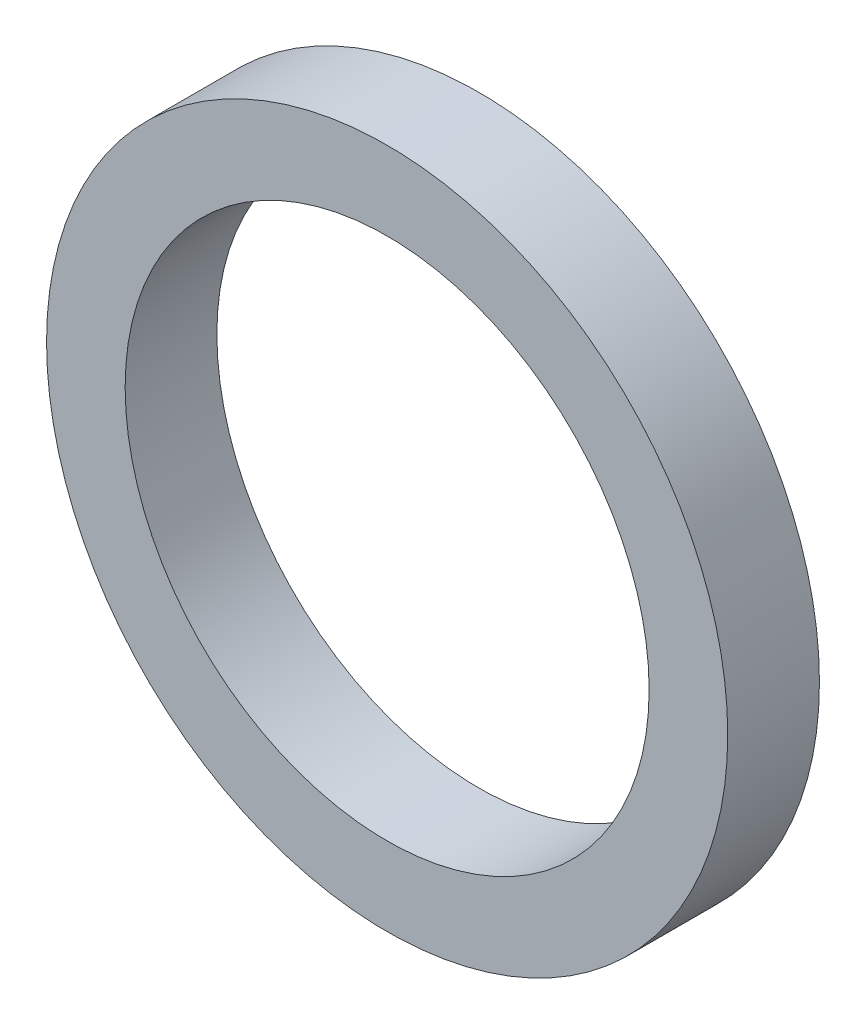
ISO-10303-21;
HEADER;
FILE_DESCRIPTION(('STEP AP214'),'2;1');
FILE_NAME('part.step','',(''),(''),'','','');
FILE_SCHEMA(('AUTOMOTIVE_DESIGN { 1 0 10303 214 1 1 1 1 }'));
ENDSEC;
DATA;
#1=APPLICATION_CONTEXT('core data for automotive mechanical design processes');
#2=APPLICATION_PROTOCOL_DEFINITION('international standard','automotive_design',2000,#1);
#3=PRODUCT_CONTEXT('',#1,'mechanical');
#4=PRODUCT('Part','Part','',(#3));
#5=PRODUCT_RELATED_PRODUCT_CATEGORY('part','',(#4));
#6=PRODUCT_DEFINITION_FORMATION('','',#4);
#7=PRODUCT_DEFINITION_CONTEXT('part definition',#1,'design');
#8=PRODUCT_DEFINITION('design','',#6,#7);
#9=PRODUCT_DEFINITION_SHAPE('','',#8);
#10=(LENGTH_UNIT() NAMED_UNIT(*) SI_UNIT(.MILLI.,.METRE.));
#11=(NAMED_UNIT(*) PLANE_ANGLE_UNIT() SI_UNIT($,.RADIAN.));
#12=(NAMED_UNIT(*) SI_UNIT($,.STERADIAN.) SOLID_ANGLE_UNIT());
#13=UNCERTAINTY_MEASURE_WITH_UNIT(LENGTH_MEASURE(1.E-05),#10,'distance_accuracy_value','');
#14=(GEOMETRIC_REPRESENTATION_CONTEXT(3) GLOBAL_UNCERTAINTY_ASSIGNED_CONTEXT((#13)) GLOBAL_UNIT_ASSIGNED_CONTEXT((#10,
#11,#12)) REPRESENTATION_CONTEXT('',''));
#15=CARTESIAN_POINT('',(0.,0.,0.));
#16=DIRECTION('',(0.,0.,1.));
#17=DIRECTION('',(1.,0.,0.));
#18=AXIS2_PLACEMENT_3D('',#15,#16,#17);
#19=CARTESIAN_POINT('',(0.,0.,7.));
#20=DIRECTION('',(0.,0.,1.));
#21=DIRECTION('',(1.,0.,0.));
#22=AXIS2_PLACEMENT_3D('',#19,#20,#21);
#23=PLANE('',#22);
#24=CARTESIAN_POINT('',(0.,0.,7.));
#25=DIRECTION('',(0.,0.,1.));
#26=DIRECTION('',(1.,0.,0.));
#27=AXIS2_PLACEMENT_3D('',#24,#25,#26);
#28=CIRCLE('',#27,26.);
#29=CARTESIAN_POINT('',(26.,0.,7.));
#30=VERTEX_POINT('',#29);
#31=EDGE_CURVE('E10',#30,#30,#28,.T.);
#32=ORIENTED_EDGE('',*,*,#31,.T.);
#33=EDGE_LOOP('',(#32));
#34=FACE_BOUND('',#33,.T.);
#35=CARTESIAN_POINT('',(0.,0.,7.));
#36=DIRECTION('',(0.,0.,1.));
#37=DIRECTION('',(1.,0.,0.));
#38=AXIS2_PLACEMENT_3D('',#35,#36,#37);
#39=CIRCLE('',#38,20.);
#40=CARTESIAN_POINT('',(20.,0.,7.));
#41=VERTEX_POINT('',#40);
#42=EDGE_CURVE('E52',#41,#41,#39,.T.);
#43=ORIENTED_EDGE('',*,*,#42,.F.);
#44=EDGE_LOOP('',(#43));
#45=FACE_BOUND('',#44,.T.);
#46=ADVANCED_FACE('F39',(#34,#45),#23,.T.);
#47=CARTESIAN_POINT('',(0.,0.,0.));
#48=DIRECTION('',(0.,0.,1.));
#49=DIRECTION('',(1.,0.,0.));
#50=AXIS2_PLACEMENT_3D('',#47,#48,#49);
#51=PLANE('',#50);
#52=CARTESIAN_POINT('',(0.,0.,0.));
#53=DIRECTION('',(0.,0.,1.));
#54=DIRECTION('',(1.,0.,0.));
#55=AXIS2_PLACEMENT_3D('',#52,#53,#54);
#56=CIRCLE('',#55,26.);
#57=CARTESIAN_POINT('',(26.,0.,0.));
#58=VERTEX_POINT('',#57);
#59=EDGE_CURVE('E43',#58,#58,#56,.T.);
#60=ORIENTED_EDGE('',*,*,#59,.F.);
#61=EDGE_LOOP('',(#60));
#62=FACE_BOUND('',#61,.T.);
#63=CARTESIAN_POINT('',(0.,0.,0.));
#64=DIRECTION('',(0.,0.,1.));
#65=DIRECTION('',(1.,0.,0.));
#66=AXIS2_PLACEMENT_3D('',#63,#64,#65);
#67=CIRCLE('',#66,20.);
#68=CARTESIAN_POINT('',(20.,0.,0.));
#69=VERTEX_POINT('',#68);
#70=EDGE_CURVE('E54',#69,#69,#67,.T.);
#71=ORIENTED_EDGE('',*,*,#70,.T.);
#72=EDGE_LOOP('',(#71));
#73=FACE_BOUND('',#72,.T.);
#74=ADVANCED_FACE('F66',(#62,#73),#51,.F.);
#75=CARTESIAN_POINT('',(0.,0.,7.));
#76=DIRECTION('',(0.,0.,-1.));
#77=DIRECTION('',(-1.,0.,0.));
#78=AXIS2_PLACEMENT_3D('',#75,#76,#77);
#79=CYLINDRICAL_SURFACE('',#78,26.);
#80=ORIENTED_EDGE('',*,*,#31,.F.);
#81=EDGE_LOOP('',(#80));
#82=FACE_BOUND('',#81,.T.);
#83=ORIENTED_EDGE('',*,*,#59,.T.);
#84=EDGE_LOOP('',(#83));
#85=FACE_BOUND('',#84,.T.);
#86=ADVANCED_FACE('F41',(#82,#85),#79,.T.);
#87=CARTESIAN_POINT('',(0.,0.,7.));
#88=DIRECTION('',(0.,0.,-1.));
#89=DIRECTION('',(-1.,0.,0.));
#90=AXIS2_PLACEMENT_3D('',#87,#88,#89);
#91=CYLINDRICAL_SURFACE('',#90,20.);
#92=ORIENTED_EDGE('',*,*,#42,.T.);
#93=EDGE_LOOP('',(#92));
#94=FACE_BOUND('',#93,.T.);
#95=ORIENTED_EDGE('',*,*,#70,.F.);
#96=EDGE_LOOP('',(#95));
#97=FACE_BOUND('',#96,.T.);
#98=ADVANCED_FACE('F62',(#94,#97),#91,.F.);
#99=CLOSED_SHELL('',(#46,#74,#86,#98));
#100=MANIFOLD_SOLID_BREP('B2',#99);
#101=ADVANCED_BREP_SHAPE_REPRESENTATION('',(#18,#100),#14);
#102=SHAPE_DEFINITION_REPRESENTATION(#9,#101);
ENDSEC;
END-ISO-10303-21;
